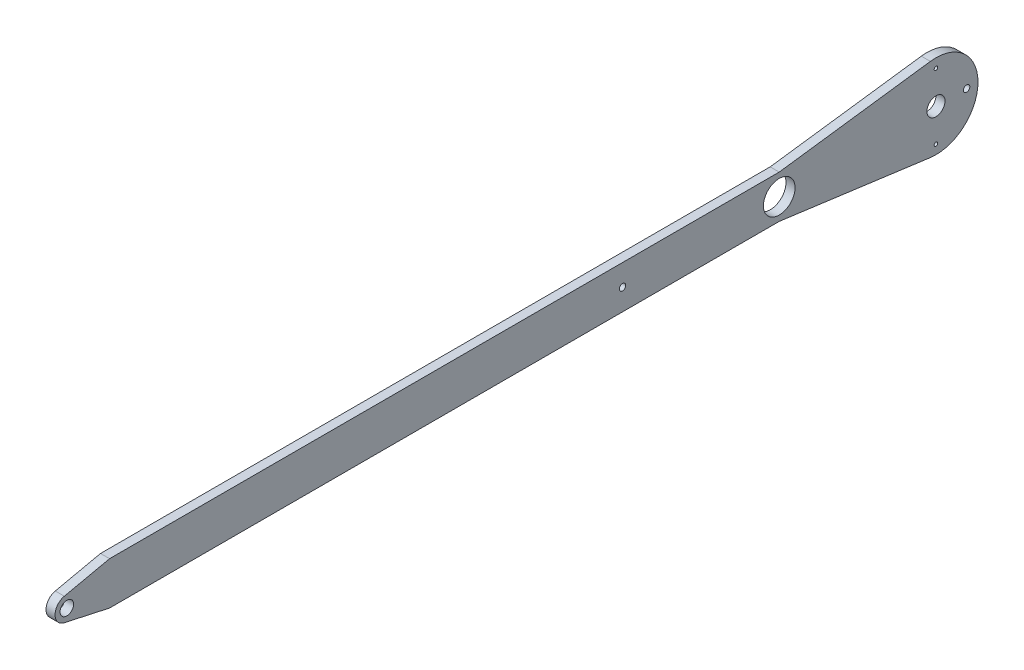
ISO-10303-21;
HEADER;
FILE_DESCRIPTION(('STEP AP214'),'2;1');
FILE_NAME('part.step','',(''),(''),'','','');
FILE_SCHEMA(('AUTOMOTIVE_DESIGN { 1 0 10303 214 1 1 1 1 }'));
ENDSEC;
DATA;
#1=APPLICATION_CONTEXT('core data for automotive mechanical design processes');
#2=APPLICATION_PROTOCOL_DEFINITION('international standard','automotive_design',2000,#1);
#3=PRODUCT_CONTEXT('',#1,'mechanical');
#4=PRODUCT('Part','Part','',(#3));
#5=PRODUCT_RELATED_PRODUCT_CATEGORY('part','',(#4));
#6=PRODUCT_DEFINITION_FORMATION('','',#4);
#7=PRODUCT_DEFINITION_CONTEXT('part definition',#1,'design');
#8=PRODUCT_DEFINITION('design','',#6,#7);
#9=PRODUCT_DEFINITION_SHAPE('','',#8);
#10=(LENGTH_UNIT() NAMED_UNIT(*) SI_UNIT(.MILLI.,.METRE.));
#11=(NAMED_UNIT(*) PLANE_ANGLE_UNIT() SI_UNIT($,.RADIAN.));
#12=(NAMED_UNIT(*) SI_UNIT($,.STERADIAN.) SOLID_ANGLE_UNIT());
#13=UNCERTAINTY_MEASURE_WITH_UNIT(LENGTH_MEASURE(1.E-05),#10,'distance_accuracy_value','');
#14=(GEOMETRIC_REPRESENTATION_CONTEXT(3) GLOBAL_UNCERTAINTY_ASSIGNED_CONTEXT((#13)) GLOBAL_UNIT_ASSIGNED_CONTEXT((#10,
#11,#12)) REPRESENTATION_CONTEXT('',''));
#15=CARTESIAN_POINT('',(0.,0.,0.));
#16=DIRECTION('',(0.,0.,1.));
#17=DIRECTION('',(1.,0.,0.));
#18=AXIS2_PLACEMENT_3D('',#15,#16,#17);
#19=CARTESIAN_POINT('',(3.175,0.,-110.));
#20=DIRECTION('',(1.,0.,0.));
#21=DIRECTION('',(0.,0.,-1.));
#22=AXIS2_PLACEMENT_3D('',#19,#20,#21);
#23=PLANE('',#22);
#24=CARTESIAN_POINT('',(3.175,0.,-131.5));
#25=DIRECTION('',(1.,0.,0.));
#26=DIRECTION('',(0.,0.,-1.));
#27=AXIS2_PLACEMENT_3D('',#24,#25,#26);
#28=CIRCLE('',#27,2.25);
#29=CARTESIAN_POINT('',(3.175,0.,-133.75));
#30=VERTEX_POINT('',#29);
#31=EDGE_CURVE('E263',#30,#30,#28,.T.);
#32=ORIENTED_EDGE('',*,*,#31,.F.);
#33=EDGE_LOOP('',(#32));
#34=FACE_BOUND('',#33,.T.);
#35=CARTESIAN_POINT('',(3.175,0.,110.));
#36=DIRECTION('',(1.,0.,0.));
#37=DIRECTION('',(0.,0.,-1.));
#38=AXIS2_PLACEMENT_3D('',#35,#36,#37);
#39=CIRCLE('',#38,2.25);
#40=CARTESIAN_POINT('',(3.175,0.,107.75));
#41=VERTEX_POINT('',#40);
#42=EDGE_CURVE('E255',#41,#41,#39,.T.);
#43=ORIENTED_EDGE('',*,*,#42,.F.);
#44=EDGE_LOOP('',(#43));
#45=FACE_BOUND('',#44,.T.);
#46=CARTESIAN_POINT('',(3.175,23.015,-110.));
#47=DIRECTION('',(1.,0.,0.));
#48=DIRECTION('',(0.,0.,-1.));
#49=AXIS2_PLACEMENT_3D('',#46,#47,#48);
#50=CIRCLE('',#49,1.25);
#51=CARTESIAN_POINT('',(3.175,23.015,-111.25));
#52=VERTEX_POINT('',#51);
#53=EDGE_CURVE('E247',#52,#52,#50,.T.);
#54=ORIENTED_EDGE('',*,*,#53,.F.);
#55=EDGE_LOOP('',(#54));
#56=FACE_BOUND('',#55,.T.);
#57=CARTESIAN_POINT('',(3.175,-23.015,-110.));
#58=DIRECTION('',(1.,0.,0.));
#59=DIRECTION('',(0.,0.,-1.));
#60=AXIS2_PLACEMENT_3D('',#57,#58,#59);
#61=CIRCLE('',#60,1.25);
#62=CARTESIAN_POINT('',(3.175,-23.015,-111.25));
#63=VERTEX_POINT('',#62);
#64=EDGE_CURVE('E239',#63,#63,#61,.T.);
#65=ORIENTED_EDGE('',*,*,#64,.F.);
#66=EDGE_LOOP('',(#65));
#67=FACE_BOUND('',#66,.T.);
#68=CARTESIAN_POINT('',(3.175,0.,0.));
#69=DIRECTION('',(1.,0.,0.));
#70=DIRECTION('',(0.,0.,-1.));
#71=AXIS2_PLACEMENT_3D('',#68,#69,#70);
#72=CIRCLE('',#71,11.1125);
#73=CARTESIAN_POINT('',(3.175,0.,-11.1125));
#74=VERTEX_POINT('',#73);
#75=EDGE_CURVE('E216',#74,#74,#72,.T.);
#76=ORIENTED_EDGE('',*,*,#75,.F.);
#77=EDGE_LOOP('',(#76));
#78=FACE_BOUND('',#77,.T.);
#79=DIRECTION('',(0.,0.,1.));
#80=VECTOR('',#79,1.);
#81=CARTESIAN_POINT('',(3.175,15.,470.));
#82=LINE('',#81,#80);
#83=CARTESIAN_POINT('',(3.175,15.,0.));
#84=VERTEX_POINT('',#83);
#85=CARTESIAN_POINT('',(3.175,15.,470.));
#86=VERTEX_POINT('',#85);
#87=EDGE_CURVE('E167',#84,#86,#82,.T.);
#88=ORIENTED_EDGE('',*,*,#87,.T.);
#89=DIRECTION('',(0.,-0.213098674662794,0.977030682658923));
#90=VECTOR('',#89,1.);
#91=CARTESIAN_POINT('',(3.175,15.,470.));
#92=LINE('',#91,#90);
#93=CARTESIAN_POINT('',(3.175,8.07271601546936,501.760727799401));
#94=VERTEX_POINT('',#93);
#95=EDGE_CURVE('E103',#86,#94,#92,.T.);
#96=ORIENTED_EDGE('',*,*,#95,.T.);
#97=CARTESIAN_POINT('',(3.175,0.,500.));
#98=DIRECTION('',(1.,0.,0.));
#99=DIRECTION('',(0.,0.,-1.));
#100=AXIS2_PLACEMENT_3D('',#97,#98,#99);
#101=CIRCLE('',#100,8.26250000000001);
#102=CARTESIAN_POINT('',(3.175,-8.07271601546936,501.760727799401));
#103=VERTEX_POINT('',#102);
#104=EDGE_CURVE('E188',#94,#103,#101,.T.);
#105=ORIENTED_EDGE('',*,*,#104,.T.);
#106=DIRECTION('',(0.,-0.213098674662795,-0.977030682658923));
#107=VECTOR('',#106,1.);
#108=CARTESIAN_POINT('',(3.175,-15.,470.));
#109=LINE('',#108,#107);
#110=CARTESIAN_POINT('',(3.175,-15.,470.));
#111=VERTEX_POINT('',#110);
#112=EDGE_CURVE('E202',#103,#111,#109,.T.);
#113=ORIENTED_EDGE('',*,*,#112,.T.);
#114=DIRECTION('',(0.,0.,-1.));
#115=VECTOR('',#114,1.);
#116=CARTESIAN_POINT('',(3.175,-15.,470.));
#117=LINE('',#116,#115);
#118=CARTESIAN_POINT('',(3.175,-15.,0.));
#119=VERTEX_POINT('',#118);
#120=EDGE_CURVE('E122',#111,#119,#117,.T.);
#121=ORIENTED_EDGE('',*,*,#120,.T.);
#122=DIRECTION('',(0.,-0.133030183627441,-0.991111986732099));
#123=VECTOR('',#122,1.);
#124=CARTESIAN_POINT('',(3.175,-15.,0.));
#125=LINE('',#124,#123);
#126=CARTESIAN_POINT('',(3.175,-29.2378036085969,-106.075609582991));
#127=VERTEX_POINT('',#126);
#128=EDGE_CURVE('E116',#119,#127,#125,.T.);
#129=ORIENTED_EDGE('',*,*,#128,.T.);
#130=CARTESIAN_POINT('',(3.175,0.,-110.));
#131=DIRECTION('',(1.,0.,0.));
#132=DIRECTION('',(0.,0.,-1.));
#133=AXIS2_PLACEMENT_3D('',#130,#131,#132);
#134=CIRCLE('',#133,29.5);
#135=CARTESIAN_POINT('',(3.175,29.2378036085969,-106.075609582991));
#136=VERTEX_POINT('',#135);
#137=EDGE_CURVE('E120',#127,#136,#134,.T.);
#138=ORIENTED_EDGE('',*,*,#137,.T.);
#139=DIRECTION('',(0.,-0.133030183627441,0.991111986732099));
#140=VECTOR('',#139,1.);
#141=CARTESIAN_POINT('',(3.175,15.,0.));
#142=LINE('',#141,#140);
#143=EDGE_CURVE('E60',#136,#84,#142,.T.);
#144=ORIENTED_EDGE('',*,*,#143,.T.);
#145=EDGE_LOOP('',(#88,#96,#105,#113,#121,#129,#138,#144));
#146=FACE_BOUND('',#145,.T.);
#147=CARTESIAN_POINT('',(3.175,0.,-110.));
#148=DIRECTION('',(1.,0.,0.));
#149=DIRECTION('',(0.,0.,-1.));
#150=AXIS2_PLACEMENT_3D('',#147,#148,#149);
#151=CIRCLE('',#150,6.35);
#152=CARTESIAN_POINT('',(3.175,0.,-116.35));
#153=VERTEX_POINT('',#152);
#154=EDGE_CURVE('E149',#153,#153,#151,.T.);
#155=ORIENTED_EDGE('',*,*,#154,.F.);
#156=EDGE_LOOP('',(#155));
#157=FACE_BOUND('',#156,.T.);
#158=CARTESIAN_POINT('',(3.175,0.,500.));
#159=DIRECTION('',(1.,0.,0.));
#160=DIRECTION('',(0.,0.,-1.));
#161=AXIS2_PLACEMENT_3D('',#158,#159,#160);
#162=CIRCLE('',#161,4.76250000000001);
#163=CARTESIAN_POINT('',(3.175,0.,495.2375));
#164=VERTEX_POINT('',#163);
#165=EDGE_CURVE('E224',#164,#164,#162,.T.);
#166=ORIENTED_EDGE('',*,*,#165,.F.);
#167=EDGE_LOOP('',(#166));
#168=FACE_BOUND('',#167,.T.);
#169=ADVANCED_FACE('F42',(#34,#45,#56,#67,#78,#146,#157,#168),#23,.T.);
#170=CARTESIAN_POINT('',(-3.175,0.,-110.));
#171=DIRECTION('',(1.,0.,0.));
#172=DIRECTION('',(0.,0.,-1.));
#173=AXIS2_PLACEMENT_3D('',#170,#171,#172);
#174=PLANE('',#173);
#175=CARTESIAN_POINT('',(-3.175,0.,-131.5));
#176=DIRECTION('',(1.,0.,0.));
#177=DIRECTION('',(0.,0.,-1.));
#178=AXIS2_PLACEMENT_3D('',#175,#176,#177);
#179=CIRCLE('',#178,2.25);
#180=CARTESIAN_POINT('',(-3.175,0.,-133.75));
#181=VERTEX_POINT('',#180);
#182=EDGE_CURVE('E259',#181,#181,#179,.T.);
#183=ORIENTED_EDGE('',*,*,#182,.T.);
#184=EDGE_LOOP('',(#183));
#185=FACE_BOUND('',#184,.T.);
#186=CARTESIAN_POINT('',(-3.175,0.,110.));
#187=DIRECTION('',(1.,0.,0.));
#188=DIRECTION('',(0.,0.,-1.));
#189=AXIS2_PLACEMENT_3D('',#186,#187,#188);
#190=CIRCLE('',#189,2.25);
#191=CARTESIAN_POINT('',(-3.175,0.,107.75));
#192=VERTEX_POINT('',#191);
#193=EDGE_CURVE('E251',#192,#192,#190,.T.);
#194=ORIENTED_EDGE('',*,*,#193,.T.);
#195=EDGE_LOOP('',(#194));
#196=FACE_BOUND('',#195,.T.);
#197=CARTESIAN_POINT('',(-3.175,23.015,-110.));
#198=DIRECTION('',(1.,0.,0.));
#199=DIRECTION('',(0.,0.,-1.));
#200=AXIS2_PLACEMENT_3D('',#197,#198,#199);
#201=CIRCLE('',#200,1.25);
#202=CARTESIAN_POINT('',(-3.175,23.015,-111.25));
#203=VERTEX_POINT('',#202);
#204=EDGE_CURVE('E243',#203,#203,#201,.T.);
#205=ORIENTED_EDGE('',*,*,#204,.T.);
#206=EDGE_LOOP('',(#205));
#207=FACE_BOUND('',#206,.T.);
#208=CARTESIAN_POINT('',(-3.175,-23.015,-110.));
#209=DIRECTION('',(1.,0.,0.));
#210=DIRECTION('',(0.,0.,-1.));
#211=AXIS2_PLACEMENT_3D('',#208,#209,#210);
#212=CIRCLE('',#211,1.25);
#213=CARTESIAN_POINT('',(-3.175,-23.015,-111.25));
#214=VERTEX_POINT('',#213);
#215=EDGE_CURVE('E232',#214,#214,#212,.T.);
#216=ORIENTED_EDGE('',*,*,#215,.T.);
#217=EDGE_LOOP('',(#216));
#218=FACE_BOUND('',#217,.T.);
#219=DIRECTION('',(0.,0.,1.));
#220=VECTOR('',#219,1.);
#221=CARTESIAN_POINT('',(-3.175,15.,470.));
#222=LINE('',#221,#220);
#223=CARTESIAN_POINT('',(-3.175,15.,0.));
#224=VERTEX_POINT('',#223);
#225=CARTESIAN_POINT('',(-3.175,15.,470.));
#226=VERTEX_POINT('',#225);
#227=EDGE_CURVE('E144',#224,#226,#222,.T.);
#228=ORIENTED_EDGE('',*,*,#227,.F.);
#229=DIRECTION('',(0.,-0.133030183627441,0.991111986732099));
#230=VECTOR('',#229,1.);
#231=CARTESIAN_POINT('',(-3.175,15.,0.));
#232=LINE('',#231,#230);
#233=CARTESIAN_POINT('',(-3.175,29.2378036085969,-106.075609582991));
#234=VERTEX_POINT('',#233);
#235=EDGE_CURVE('E95',#234,#224,#232,.T.);
#236=ORIENTED_EDGE('',*,*,#235,.F.);
#237=CARTESIAN_POINT('',(-3.175,0.,-110.));
#238=DIRECTION('',(1.,0.,0.));
#239=DIRECTION('',(0.,0.,-1.));
#240=AXIS2_PLACEMENT_3D('',#237,#238,#239);
#241=CIRCLE('',#240,29.5);
#242=CARTESIAN_POINT('',(-3.175,-29.2378036085969,-106.075609582991));
#243=VERTEX_POINT('',#242);
#244=EDGE_CURVE('E89',#243,#234,#241,.T.);
#245=ORIENTED_EDGE('',*,*,#244,.F.);
#246=DIRECTION('',(0.,-0.133030183627441,-0.991111986732099));
#247=VECTOR('',#246,1.);
#248=CARTESIAN_POINT('',(-3.175,-15.,0.));
#249=LINE('',#248,#247);
#250=CARTESIAN_POINT('',(-3.175,-15.,0.));
#251=VERTEX_POINT('',#250);
#252=EDGE_CURVE('E131',#251,#243,#249,.T.);
#253=ORIENTED_EDGE('',*,*,#252,.F.);
#254=DIRECTION('',(0.,0.,-1.));
#255=VECTOR('',#254,1.);
#256=CARTESIAN_POINT('',(-3.175,-15.,470.));
#257=LINE('',#256,#255);
#258=CARTESIAN_POINT('',(-3.175,-15.,470.));
#259=VERTEX_POINT('',#258);
#260=EDGE_CURVE('E158',#259,#251,#257,.T.);
#261=ORIENTED_EDGE('',*,*,#260,.F.);
#262=DIRECTION('',(0.,-0.213098674662795,-0.977030682658923));
#263=VECTOR('',#262,1.);
#264=CARTESIAN_POINT('',(-3.175,-15.,470.));
#265=LINE('',#264,#263);
#266=CARTESIAN_POINT('',(-3.175,-8.07271601546936,501.760727799401));
#267=VERTEX_POINT('',#266);
#268=EDGE_CURVE('E155',#267,#259,#265,.T.);
#269=ORIENTED_EDGE('',*,*,#268,.F.);
#270=CARTESIAN_POINT('',(-3.175,0.,500.));
#271=DIRECTION('',(1.,0.,0.));
#272=DIRECTION('',(0.,0.,-1.));
#273=AXIS2_PLACEMENT_3D('',#270,#271,#272);
#274=CIRCLE('',#273,8.26250000000001);
#275=CARTESIAN_POINT('',(-3.175,8.07271601546936,501.760727799401));
#276=VERTEX_POINT('',#275);
#277=EDGE_CURVE('E152',#276,#267,#274,.T.);
#278=ORIENTED_EDGE('',*,*,#277,.F.);
#279=DIRECTION('',(0.,-0.213098674662794,0.977030682658923));
#280=VECTOR('',#279,1.);
#281=CARTESIAN_POINT('',(-3.175,15.,470.));
#282=LINE('',#281,#280);
#283=EDGE_CURVE('E148',#226,#276,#282,.T.);
#284=ORIENTED_EDGE('',*,*,#283,.F.);
#285=EDGE_LOOP('',(#228,#236,#245,#253,#261,#269,#278,#284));
#286=FACE_BOUND('',#285,.T.);
#287=CARTESIAN_POINT('',(-3.175,0.,-110.));
#288=DIRECTION('',(1.,0.,0.));
#289=DIRECTION('',(0.,0.,-1.));
#290=AXIS2_PLACEMENT_3D('',#287,#288,#289);
#291=CIRCLE('',#290,6.35);
#292=CARTESIAN_POINT('',(-3.175,0.,-116.35));
#293=VERTEX_POINT('',#292);
#294=EDGE_CURVE('E212',#293,#293,#291,.T.);
#295=ORIENTED_EDGE('',*,*,#294,.T.);
#296=EDGE_LOOP('',(#295));
#297=FACE_BOUND('',#296,.T.);
#298=CARTESIAN_POINT('',(-3.175,0.,0.));
#299=DIRECTION('',(1.,0.,0.));
#300=DIRECTION('',(0.,0.,-1.));
#301=AXIS2_PLACEMENT_3D('',#298,#299,#300);
#302=CIRCLE('',#301,11.1125);
#303=CARTESIAN_POINT('',(-3.175,0.,-11.1125));
#304=VERTEX_POINT('',#303);
#305=EDGE_CURVE('E220',#304,#304,#302,.T.);
#306=ORIENTED_EDGE('',*,*,#305,.T.);
#307=EDGE_LOOP('',(#306));
#308=FACE_BOUND('',#307,.T.);
#309=CARTESIAN_POINT('',(-3.175,0.,500.));
#310=DIRECTION('',(1.,0.,0.));
#311=DIRECTION('',(0.,0.,-1.));
#312=AXIS2_PLACEMENT_3D('',#309,#310,#311);
#313=CIRCLE('',#312,4.76250000000001);
#314=CARTESIAN_POINT('',(-3.175,0.,495.2375));
#315=VERTEX_POINT('',#314);
#316=EDGE_CURVE('E228',#315,#315,#313,.T.);
#317=ORIENTED_EDGE('',*,*,#316,.T.);
#318=EDGE_LOOP('',(#317));
#319=FACE_BOUND('',#318,.T.);
#320=ADVANCED_FACE('F192',(#185,#196,#207,#218,#286,#297,#308,#319),#174,.F.);
#321=CARTESIAN_POINT('',(3.175,15.,470.));
#322=DIRECTION('',(0.,-1.,0.));
#323=DIRECTION('',(0.,0.,-1.));
#324=AXIS2_PLACEMENT_3D('',#321,#322,#323);
#325=PLANE('',#324);
#326=ORIENTED_EDGE('',*,*,#227,.T.);
#327=DIRECTION('',(-1.,0.,0.));
#328=VECTOR('',#327,1.);
#329=CARTESIAN_POINT('',(3.175,15.,470.));
#330=LINE('',#329,#328);
#331=EDGE_CURVE('E11',#86,#226,#330,.T.);
#332=ORIENTED_EDGE('',*,*,#331,.F.);
#333=ORIENTED_EDGE('',*,*,#87,.F.);
#334=DIRECTION('',(-1.,0.,0.));
#335=VECTOR('',#334,1.);
#336=CARTESIAN_POINT('',(3.175,15.,0.));
#337=LINE('',#336,#335);
#338=EDGE_CURVE('E140',#84,#224,#337,.T.);
#339=ORIENTED_EDGE('',*,*,#338,.T.);
#340=EDGE_LOOP('',(#326,#332,#333,#339));
#341=FACE_BOUND('',#340,.T.);
#342=ADVANCED_FACE('F44',(#341),#325,.F.);
#343=CARTESIAN_POINT('',(3.175,15.,470.));
#344=DIRECTION('',(0.,-0.977030682658923,-0.213098674662794));
#345=DIRECTION('',(0.,0.213098674662794,-0.977030682658923));
#346=AXIS2_PLACEMENT_3D('',#343,#344,#345);
#347=PLANE('',#346);
#348=ORIENTED_EDGE('',*,*,#283,.T.);
#349=DIRECTION('',(-1.,0.,0.));
#350=VECTOR('',#349,1.);
#351=CARTESIAN_POINT('',(3.175,8.07271601546936,501.760727799401));
#352=LINE('',#351,#350);
#353=EDGE_CURVE('E52',#94,#276,#352,.T.);
#354=ORIENTED_EDGE('',*,*,#353,.F.);
#355=ORIENTED_EDGE('',*,*,#95,.F.);
#356=ORIENTED_EDGE('',*,*,#331,.T.);
#357=EDGE_LOOP('',(#348,#354,#355,#356));
#358=FACE_BOUND('',#357,.T.);
#359=ADVANCED_FACE('F323',(#358),#347,.F.);
#360=CARTESIAN_POINT('',(3.175,0.,500.));
#361=DIRECTION('',(-1.,0.,0.));
#362=DIRECTION('',(0.,0.,1.));
#363=AXIS2_PLACEMENT_3D('',#360,#361,#362);
#364=CYLINDRICAL_SURFACE('',#363,8.26250000000001);
#365=ORIENTED_EDGE('',*,*,#277,.T.);
#366=DIRECTION('',(-1.,0.,0.));
#367=VECTOR('',#366,1.);
#368=CARTESIAN_POINT('',(3.175,-8.07271601546936,501.760727799401));
#369=LINE('',#368,#367);
#370=EDGE_CURVE('E178',#103,#267,#369,.T.);
#371=ORIENTED_EDGE('',*,*,#370,.F.);
#372=ORIENTED_EDGE('',*,*,#104,.F.);
#373=ORIENTED_EDGE('',*,*,#353,.T.);
#374=EDGE_LOOP('',(#365,#371,#372,#373));
#375=FACE_BOUND('',#374,.T.);
#376=ADVANCED_FACE('F186',(#375),#364,.T.);
#377=CARTESIAN_POINT('',(3.175,-15.,470.));
#378=DIRECTION('',(0.,0.977030682658923,-0.213098674662795));
#379=DIRECTION('',(0.,0.213098674662795,0.977030682658923));
#380=AXIS2_PLACEMENT_3D('',#377,#378,#379);
#381=PLANE('',#380);
#382=ORIENTED_EDGE('',*,*,#268,.T.);
#383=DIRECTION('',(-1.,0.,0.));
#384=VECTOR('',#383,1.);
#385=CARTESIAN_POINT('',(3.175,-15.,470.));
#386=LINE('',#385,#384);
#387=EDGE_CURVE('E174',#111,#259,#386,.T.);
#388=ORIENTED_EDGE('',*,*,#387,.F.);
#389=ORIENTED_EDGE('',*,*,#112,.F.);
#390=ORIENTED_EDGE('',*,*,#370,.T.);
#391=EDGE_LOOP('',(#382,#388,#389,#390));
#392=FACE_BOUND('',#391,.T.);
#393=ADVANCED_FACE('F197',(#392),#381,.F.);
#394=CARTESIAN_POINT('',(3.175,-15.,470.));
#395=DIRECTION('',(0.,1.,0.));
#396=DIRECTION('',(0.,0.,1.));
#397=AXIS2_PLACEMENT_3D('',#394,#395,#396);
#398=PLANE('',#397);
#399=ORIENTED_EDGE('',*,*,#260,.T.);
#400=DIRECTION('',(-1.,0.,0.));
#401=VECTOR('',#400,1.);
#402=CARTESIAN_POINT('',(3.175,-15.,0.));
#403=LINE('',#402,#401);
#404=EDGE_CURVE('E133',#119,#251,#403,.T.);
#405=ORIENTED_EDGE('',*,*,#404,.F.);
#406=ORIENTED_EDGE('',*,*,#120,.F.);
#407=ORIENTED_EDGE('',*,*,#387,.T.);
#408=EDGE_LOOP('',(#399,#405,#406,#407));
#409=FACE_BOUND('',#408,.T.);
#410=ADVANCED_FACE('F200',(#409),#398,.F.);
#411=CARTESIAN_POINT('',(3.175,-15.,0.));
#412=DIRECTION('',(0.,0.991111986732099,-0.133030183627441));
#413=DIRECTION('',(0.,0.133030183627441,0.9911119867321));
#414=AXIS2_PLACEMENT_3D('',#411,#412,#413);
#415=PLANE('',#414);
#416=ORIENTED_EDGE('',*,*,#252,.T.);
#417=DIRECTION('',(-1.,0.,0.));
#418=VECTOR('',#417,1.);
#419=CARTESIAN_POINT('',(3.175,-29.2378036085969,-106.075609582991));
#420=LINE('',#419,#418);
#421=EDGE_CURVE('E128',#127,#243,#420,.T.);
#422=ORIENTED_EDGE('',*,*,#421,.F.);
#423=ORIENTED_EDGE('',*,*,#128,.F.);
#424=ORIENTED_EDGE('',*,*,#404,.T.);
#425=EDGE_LOOP('',(#416,#422,#423,#424));
#426=FACE_BOUND('',#425,.T.);
#427=ADVANCED_FACE('F129',(#426),#415,.F.);
#428=CARTESIAN_POINT('',(3.175,0.,-110.));
#429=DIRECTION('',(-1.,0.,0.));
#430=DIRECTION('',(0.,0.,1.));
#431=AXIS2_PLACEMENT_3D('',#428,#429,#430);
#432=CYLINDRICAL_SURFACE('',#431,29.5);
#433=ORIENTED_EDGE('',*,*,#244,.T.);
#434=DIRECTION('',(-1.,0.,0.));
#435=VECTOR('',#434,1.);
#436=CARTESIAN_POINT('',(3.175,29.2378036085969,-106.075609582991));
#437=LINE('',#436,#435);
#438=EDGE_CURVE('E134',#136,#234,#437,.T.);
#439=ORIENTED_EDGE('',*,*,#438,.F.);
#440=ORIENTED_EDGE('',*,*,#137,.F.);
#441=ORIENTED_EDGE('',*,*,#421,.T.);
#442=EDGE_LOOP('',(#433,#439,#440,#441));
#443=FACE_BOUND('',#442,.T.);
#444=ADVANCED_FACE('F136',(#443),#432,.T.);
#445=CARTESIAN_POINT('',(3.175,15.,0.));
#446=DIRECTION('',(0.,-0.991111986732099,-0.133030183627441));
#447=DIRECTION('',(0.,0.133030183627441,-0.9911119867321));
#448=AXIS2_PLACEMENT_3D('',#445,#446,#447);
#449=PLANE('',#448);
#450=ORIENTED_EDGE('',*,*,#235,.T.);
#451=ORIENTED_EDGE('',*,*,#338,.F.);
#452=ORIENTED_EDGE('',*,*,#143,.F.);
#453=ORIENTED_EDGE('',*,*,#438,.T.);
#454=EDGE_LOOP('',(#450,#451,#452,#453));
#455=FACE_BOUND('',#454,.T.);
#456=ADVANCED_FACE('F309',(#455),#449,.F.);
#457=CARTESIAN_POINT('',(3.175,0.,-110.));
#458=DIRECTION('',(-1.,0.,0.));
#459=DIRECTION('',(0.,0.,1.));
#460=AXIS2_PLACEMENT_3D('',#457,#458,#459);
#461=CYLINDRICAL_SURFACE('',#460,6.35);
#462=ORIENTED_EDGE('',*,*,#154,.T.);
#463=EDGE_LOOP('',(#462));
#464=FACE_BOUND('',#463,.T.);
#465=ORIENTED_EDGE('',*,*,#294,.F.);
#466=EDGE_LOOP('',(#465));
#467=FACE_BOUND('',#466,.T.);
#468=ADVANCED_FACE('F285',(#464,#467),#461,.F.);
#469=CARTESIAN_POINT('',(3.175,0.,0.));
#470=DIRECTION('',(-1.,0.,0.));
#471=DIRECTION('',(0.,0.,1.));
#472=AXIS2_PLACEMENT_3D('',#469,#470,#471);
#473=CYLINDRICAL_SURFACE('',#472,11.1125);
#474=ORIENTED_EDGE('',*,*,#75,.T.);
#475=EDGE_LOOP('',(#474));
#476=FACE_BOUND('',#475,.T.);
#477=ORIENTED_EDGE('',*,*,#305,.F.);
#478=EDGE_LOOP('',(#477));
#479=FACE_BOUND('',#478,.T.);
#480=ADVANCED_FACE('F281',(#476,#479),#473,.F.);
#481=CARTESIAN_POINT('',(3.175,0.,500.));
#482=DIRECTION('',(-1.,0.,0.));
#483=DIRECTION('',(0.,0.,1.));
#484=AXIS2_PLACEMENT_3D('',#481,#482,#483);
#485=CYLINDRICAL_SURFACE('',#484,4.76250000000001);
#486=ORIENTED_EDGE('',*,*,#165,.T.);
#487=EDGE_LOOP('',(#486));
#488=FACE_BOUND('',#487,.T.);
#489=ORIENTED_EDGE('',*,*,#316,.F.);
#490=EDGE_LOOP('',(#489));
#491=FACE_BOUND('',#490,.T.);
#492=ADVANCED_FACE('F284',(#488,#491),#485,.F.);
#493=CARTESIAN_POINT('',(3.175,-23.015,-110.));
#494=DIRECTION('',(1.,0.,0.));
#495=DIRECTION('',(0.,0.,-1.));
#496=AXIS2_PLACEMENT_3D('',#493,#494,#495);
#497=CYLINDRICAL_SURFACE('',#496,1.25);
#498=ORIENTED_EDGE('',*,*,#215,.F.);
#499=EDGE_LOOP('',(#498));
#500=FACE_BOUND('',#499,.T.);
#501=ORIENTED_EDGE('',*,*,#64,.T.);
#502=EDGE_LOOP('',(#501));
#503=FACE_BOUND('',#502,.T.);
#504=ADVANCED_FACE('F296',(#500,#503),#497,.F.);
#505=CARTESIAN_POINT('',(3.175,23.015,-110.));
#506=DIRECTION('',(1.,0.,0.));
#507=DIRECTION('',(0.,0.,-1.));
#508=AXIS2_PLACEMENT_3D('',#505,#506,#507);
#509=CYLINDRICAL_SURFACE('',#508,1.25);
#510=ORIENTED_EDGE('',*,*,#204,.F.);
#511=EDGE_LOOP('',(#510));
#512=FACE_BOUND('',#511,.T.);
#513=ORIENTED_EDGE('',*,*,#53,.T.);
#514=EDGE_LOOP('',(#513));
#515=FACE_BOUND('',#514,.T.);
#516=ADVANCED_FACE('F303',(#512,#515),#509,.F.);
#517=CARTESIAN_POINT('',(3.175,0.,110.));
#518=DIRECTION('',(1.,0.,0.));
#519=DIRECTION('',(0.,0.,-1.));
#520=AXIS2_PLACEMENT_3D('',#517,#518,#519);
#521=CYLINDRICAL_SURFACE('',#520,2.25);
#522=ORIENTED_EDGE('',*,*,#193,.F.);
#523=EDGE_LOOP('',(#522));
#524=FACE_BOUND('',#523,.T.);
#525=ORIENTED_EDGE('',*,*,#42,.T.);
#526=EDGE_LOOP('',(#525));
#527=FACE_BOUND('',#526,.T.);
#528=ADVANCED_FACE('F356',(#524,#527),#521,.F.);
#529=CARTESIAN_POINT('',(3.175,0.,-131.5));
#530=DIRECTION('',(1.,0.,0.));
#531=DIRECTION('',(0.,0.,-1.));
#532=AXIS2_PLACEMENT_3D('',#529,#530,#531);
#533=CYLINDRICAL_SURFACE('',#532,2.25);
#534=ORIENTED_EDGE('',*,*,#182,.F.);
#535=EDGE_LOOP('',(#534));
#536=FACE_BOUND('',#535,.T.);
#537=ORIENTED_EDGE('',*,*,#31,.T.);
#538=EDGE_LOOP('',(#537));
#539=FACE_BOUND('',#538,.T.);
#540=ADVANCED_FACE('F268',(#536,#539),#533,.F.);
#541=CLOSED_SHELL('',(#169,#320,#342,#359,#376,#393,#410,#427,#444,#456,#468,#480,#492,#504,
#516,#528,#540));
#542=MANIFOLD_SOLID_BREP('B2',#541);
#543=ADVANCED_BREP_SHAPE_REPRESENTATION('',(#18,#542),#14);
#544=SHAPE_DEFINITION_REPRESENTATION(#9,#543);
ENDSEC;
END-ISO-10303-21;
